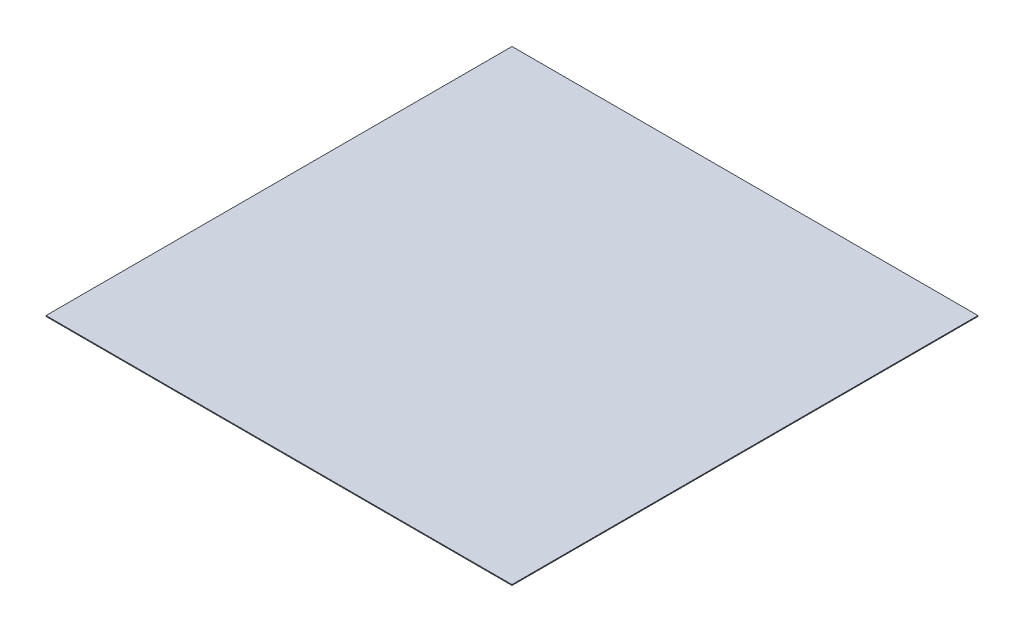
ISO-10303-21;
HEADER;
FILE_DESCRIPTION(('STEP AP214'),'2;1');
FILE_NAME('part.step','',(''),(''),'','','');
FILE_SCHEMA(('AUTOMOTIVE_DESIGN { 1 0 10303 214 1 1 1 1 }'));
ENDSEC;
DATA;
#1=APPLICATION_CONTEXT('core data for automotive mechanical design processes');
#2=APPLICATION_PROTOCOL_DEFINITION('international standard','automotive_design',2000,#1);
#3=PRODUCT_CONTEXT('',#1,'mechanical');
#4=PRODUCT('Part','Part','',(#3));
#5=PRODUCT_RELATED_PRODUCT_CATEGORY('part','',(#4));
#6=PRODUCT_DEFINITION_FORMATION('','',#4);
#7=PRODUCT_DEFINITION_CONTEXT('part definition',#1,'design');
#8=PRODUCT_DEFINITION('design','',#6,#7);
#9=PRODUCT_DEFINITION_SHAPE('','',#8);
#10=(LENGTH_UNIT() NAMED_UNIT(*) SI_UNIT(.MILLI.,.METRE.));
#11=(NAMED_UNIT(*) PLANE_ANGLE_UNIT() SI_UNIT($,.RADIAN.));
#12=(NAMED_UNIT(*) SI_UNIT($,.STERADIAN.) SOLID_ANGLE_UNIT());
#13=UNCERTAINTY_MEASURE_WITH_UNIT(LENGTH_MEASURE(1.E-05),#10,'distance_accuracy_value','');
#14=(GEOMETRIC_REPRESENTATION_CONTEXT(3) GLOBAL_UNCERTAINTY_ASSIGNED_CONTEXT((#13)) GLOBAL_UNIT_ASSIGNED_CONTEXT((#10,
#11,#12)) REPRESENTATION_CONTEXT('',''));
#15=CARTESIAN_POINT('',(0.,0.,0.));
#16=DIRECTION('',(0.,0.,1.));
#17=DIRECTION('',(1.,0.,0.));
#18=AXIS2_PLACEMENT_3D('',#15,#16,#17);
#19=CARTESIAN_POINT('',(70.,0.125,70.));
#20=DIRECTION('',(-1.,0.,0.));
#21=DIRECTION('',(0.,0.,1.));
#22=AXIS2_PLACEMENT_3D('',#19,#20,#21);
#23=PLANE('',#22);
#24=DIRECTION('',(0.,0.,-1.));
#25=VECTOR('',#24,1.);
#26=CARTESIAN_POINT('',(70.,-0.125,70.));
#27=LINE('',#26,#25);
#28=CARTESIAN_POINT('',(70.,-0.125,70.));
#29=VERTEX_POINT('',#28);
#30=CARTESIAN_POINT('',(70.,-0.125,-70.));
#31=VERTEX_POINT('',#30);
#32=EDGE_CURVE('E96',#29,#31,#27,.T.);
#33=ORIENTED_EDGE('',*,*,#32,.T.);
#34=DIRECTION('',(0.,-1.,0.));
#35=VECTOR('',#34,1.);
#36=CARTESIAN_POINT('',(70.,0.125,-70.));
#37=LINE('',#36,#35);
#38=CARTESIAN_POINT('',(70.,0.125,-70.));
#39=VERTEX_POINT('',#38);
#40=EDGE_CURVE('E11',#39,#31,#37,.T.);
#41=ORIENTED_EDGE('',*,*,#40,.F.);
#42=DIRECTION('',(0.,0.,-1.));
#43=VECTOR('',#42,1.);
#44=CARTESIAN_POINT('',(70.,0.125,70.));
#45=LINE('',#44,#43);
#46=CARTESIAN_POINT('',(70.,0.125,70.));
#47=VERTEX_POINT('',#46);
#48=EDGE_CURVE('E84',#47,#39,#45,.T.);
#49=ORIENTED_EDGE('',*,*,#48,.F.);
#50=DIRECTION('',(0.,-1.,0.));
#51=VECTOR('',#50,1.);
#52=CARTESIAN_POINT('',(70.,0.125,70.));
#53=LINE('',#52,#51);
#54=EDGE_CURVE('E92',#47,#29,#53,.T.);
#55=ORIENTED_EDGE('',*,*,#54,.T.);
#56=EDGE_LOOP('',(#33,#41,#49,#55));
#57=FACE_BOUND('',#56,.T.);
#58=ADVANCED_FACE('F33',(#57),#23,.F.);
#59=CARTESIAN_POINT('',(-70.,0.125,-70.));
#60=DIRECTION('',(0.,0.,1.));
#61=DIRECTION('',(1.,0.,0.));
#62=AXIS2_PLACEMENT_3D('',#59,#60,#61);
#63=PLANE('',#62);
#64=DIRECTION('',(-1.,0.,0.));
#65=VECTOR('',#64,1.);
#66=CARTESIAN_POINT('',(-70.,-0.125,-70.));
#67=LINE('',#66,#65);
#68=CARTESIAN_POINT('',(-70.,-0.125,-70.));
#69=VERTEX_POINT('',#68);
#70=EDGE_CURVE('E88',#31,#69,#67,.T.);
#71=ORIENTED_EDGE('',*,*,#70,.T.);
#72=DIRECTION('',(0.,-1.,0.));
#73=VECTOR('',#72,1.);
#74=CARTESIAN_POINT('',(-70.,0.125,-70.));
#75=LINE('',#74,#73);
#76=CARTESIAN_POINT('',(-70.,0.125,-70.));
#77=VERTEX_POINT('',#76);
#78=EDGE_CURVE('E41',#77,#69,#75,.T.);
#79=ORIENTED_EDGE('',*,*,#78,.F.);
#80=DIRECTION('',(-1.,0.,0.));
#81=VECTOR('',#80,1.);
#82=CARTESIAN_POINT('',(-70.,0.125,-70.));
#83=LINE('',#82,#81);
#84=EDGE_CURVE('E79',#39,#77,#83,.T.);
#85=ORIENTED_EDGE('',*,*,#84,.F.);
#86=ORIENTED_EDGE('',*,*,#40,.T.);
#87=EDGE_LOOP('',(#71,#79,#85,#86));
#88=FACE_BOUND('',#87,.T.);
#89=ADVANCED_FACE('F87',(#88),#63,.F.);
#90=CARTESIAN_POINT('',(-70.,0.125,70.));
#91=DIRECTION('',(1.,0.,0.));
#92=DIRECTION('',(0.,0.,-1.));
#93=AXIS2_PLACEMENT_3D('',#90,#91,#92);
#94=PLANE('',#93);
#95=DIRECTION('',(0.,0.,1.));
#96=VECTOR('',#95,1.);
#97=CARTESIAN_POINT('',(-70.,-0.125,70.));
#98=LINE('',#97,#96);
#99=CARTESIAN_POINT('',(-70.,-0.125,70.));
#100=VERTEX_POINT('',#99);
#101=EDGE_CURVE('E66',#69,#100,#98,.T.);
#102=ORIENTED_EDGE('',*,*,#101,.T.);
#103=DIRECTION('',(0.,-1.,0.));
#104=VECTOR('',#103,1.);
#105=CARTESIAN_POINT('',(-70.,0.125,70.));
#106=LINE('',#105,#104);
#107=CARTESIAN_POINT('',(-70.,0.125,70.));
#108=VERTEX_POINT('',#107);
#109=EDGE_CURVE('E89',#108,#100,#106,.T.);
#110=ORIENTED_EDGE('',*,*,#109,.F.);
#111=DIRECTION('',(0.,0.,1.));
#112=VECTOR('',#111,1.);
#113=CARTESIAN_POINT('',(-70.,0.125,70.));
#114=LINE('',#113,#112);
#115=EDGE_CURVE('E82',#77,#108,#114,.T.);
#116=ORIENTED_EDGE('',*,*,#115,.F.);
#117=ORIENTED_EDGE('',*,*,#78,.T.);
#118=EDGE_LOOP('',(#102,#110,#116,#117));
#119=FACE_BOUND('',#118,.T.);
#120=ADVANCED_FACE('F90',(#119),#94,.F.);
#121=CARTESIAN_POINT('',(-70.,0.125,70.));
#122=DIRECTION('',(0.,0.,-1.));
#123=DIRECTION('',(-1.,0.,0.));
#124=AXIS2_PLACEMENT_3D('',#121,#122,#123);
#125=PLANE('',#124);
#126=DIRECTION('',(1.,0.,0.));
#127=VECTOR('',#126,1.);
#128=CARTESIAN_POINT('',(-70.,-0.125,70.));
#129=LINE('',#128,#127);
#130=EDGE_CURVE('E72',#100,#29,#129,.T.);
#131=ORIENTED_EDGE('',*,*,#130,.T.);
#132=ORIENTED_EDGE('',*,*,#54,.F.);
#133=DIRECTION('',(1.,0.,0.));
#134=VECTOR('',#133,1.);
#135=CARTESIAN_POINT('',(-70.,0.125,70.));
#136=LINE('',#135,#134);
#137=EDGE_CURVE('E49',#108,#47,#136,.T.);
#138=ORIENTED_EDGE('',*,*,#137,.F.);
#139=ORIENTED_EDGE('',*,*,#109,.T.);
#140=EDGE_LOOP('',(#131,#132,#138,#139));
#141=FACE_BOUND('',#140,.T.);
#142=ADVANCED_FACE('F103',(#141),#125,.F.);
#143=CARTESIAN_POINT('',(0.,0.125,0.));
#144=DIRECTION('',(0.,-1.,0.));
#145=DIRECTION('',(0.,0.,-1.));
#146=AXIS2_PLACEMENT_3D('',#143,#144,#145);
#147=PLANE('',#146);
#148=ORIENTED_EDGE('',*,*,#48,.T.);
#149=ORIENTED_EDGE('',*,*,#84,.T.);
#150=ORIENTED_EDGE('',*,*,#115,.T.);
#151=ORIENTED_EDGE('',*,*,#137,.T.);
#152=EDGE_LOOP('',(#148,#149,#150,#151));
#153=FACE_BOUND('',#152,.T.);
#154=ADVANCED_FACE('F80',(#153),#147,.F.);
#155=CARTESIAN_POINT('',(0.,-0.125,0.));
#156=DIRECTION('',(0.,-1.,0.));
#157=DIRECTION('',(0.,0.,-1.));
#158=AXIS2_PLACEMENT_3D('',#155,#156,#157);
#159=PLANE('',#158);
#160=ORIENTED_EDGE('',*,*,#32,.F.);
#161=ORIENTED_EDGE('',*,*,#130,.F.);
#162=ORIENTED_EDGE('',*,*,#101,.F.);
#163=ORIENTED_EDGE('',*,*,#70,.F.);
#164=EDGE_LOOP('',(#160,#161,#162,#163));
#165=FACE_BOUND('',#164,.T.);
#166=ADVANCED_FACE('F106',(#165),#159,.T.);
#167=CLOSED_SHELL('',(#58,#89,#120,#142,#154,#166));
#168=MANIFOLD_SOLID_BREP('B2',#167);
#169=ADVANCED_BREP_SHAPE_REPRESENTATION('',(#18,#168),#14);
#170=SHAPE_DEFINITION_REPRESENTATION(#9,#169);
ENDSEC;
END-ISO-10303-21;
